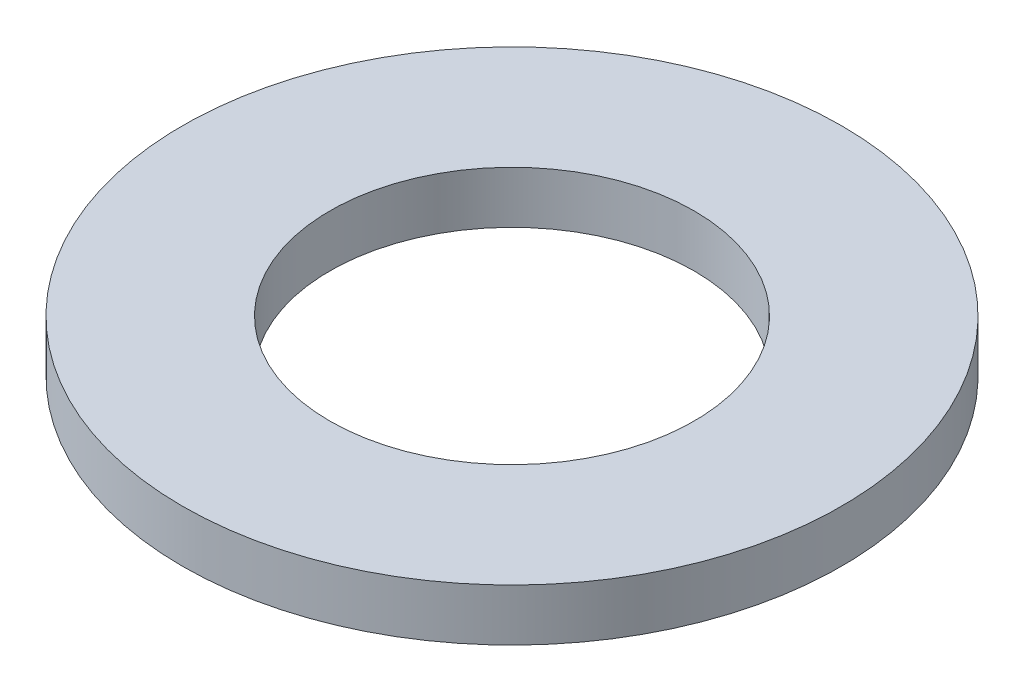
ISO-10303-21;
HEADER;
FILE_DESCRIPTION(('STEP AP214'),'2;1');
FILE_NAME('part.step','',(''),(''),'','','');
FILE_SCHEMA(('AUTOMOTIVE_DESIGN { 1 0 10303 214 1 1 1 1 }'));
ENDSEC;
DATA;
#1=APPLICATION_CONTEXT('core data for automotive mechanical design processes');
#2=APPLICATION_PROTOCOL_DEFINITION('international standard','automotive_design',2000,#1);
#3=PRODUCT_CONTEXT('',#1,'mechanical');
#4=PRODUCT('Part','Part','',(#3));
#5=PRODUCT_RELATED_PRODUCT_CATEGORY('part','',(#4));
#6=PRODUCT_DEFINITION_FORMATION('','',#4);
#7=PRODUCT_DEFINITION_CONTEXT('part definition',#1,'design');
#8=PRODUCT_DEFINITION('design','',#6,#7);
#9=PRODUCT_DEFINITION_SHAPE('','',#8);
#10=(LENGTH_UNIT() NAMED_UNIT(*) SI_UNIT(.MILLI.,.METRE.));
#11=(NAMED_UNIT(*) PLANE_ANGLE_UNIT() SI_UNIT($,.RADIAN.));
#12=(NAMED_UNIT(*) SI_UNIT($,.STERADIAN.) SOLID_ANGLE_UNIT());
#13=UNCERTAINTY_MEASURE_WITH_UNIT(LENGTH_MEASURE(1.E-05),#10,'distance_accuracy_value','');
#14=(GEOMETRIC_REPRESENTATION_CONTEXT(3) GLOBAL_UNCERTAINTY_ASSIGNED_CONTEXT((#13)) GLOBAL_UNIT_ASSIGNED_CONTEXT((#10,
#11,#12)) REPRESENTATION_CONTEXT('',''));
#15=CARTESIAN_POINT('',(0.,0.,0.));
#16=DIRECTION('',(0.,0.,1.));
#17=DIRECTION('',(1.,0.,0.));
#18=AXIS2_PLACEMENT_3D('',#15,#16,#17);
#19=CARTESIAN_POINT('',(0.,6.,0.));
#20=DIRECTION('',(0.,1.,0.));
#21=DIRECTION('',(0.,0.,1.));
#22=AXIS2_PLACEMENT_3D('',#19,#20,#21);
#23=PLANE('',#22);
#24=CARTESIAN_POINT('',(0.,6.,0.));
#25=DIRECTION('',(0.,1.,0.));
#26=DIRECTION('',(0.,0.,1.));
#27=AXIS2_PLACEMENT_3D('',#24,#25,#26);
#28=CIRCLE('',#27,38.);
#29=CARTESIAN_POINT('',(0.,6.,38.));
#30=VERTEX_POINT('',#29);
#31=EDGE_CURVE('E10',#30,#30,#28,.T.);
#32=ORIENTED_EDGE('',*,*,#31,.T.);
#33=EDGE_LOOP('',(#32));
#34=FACE_BOUND('',#33,.T.);
#35=CARTESIAN_POINT('',(0.,6.,0.));
#36=DIRECTION('',(0.,1.,0.));
#37=DIRECTION('',(0.,0.,1.));
#38=AXIS2_PLACEMENT_3D('',#35,#36,#37);
#39=CIRCLE('',#38,21.);
#40=CARTESIAN_POINT('',(0.,6.,21.));
#41=VERTEX_POINT('',#40);
#42=EDGE_CURVE('E48',#41,#41,#39,.T.);
#43=ORIENTED_EDGE('',*,*,#42,.F.);
#44=EDGE_LOOP('',(#43));
#45=FACE_BOUND('',#44,.T.);
#46=ADVANCED_FACE('F37',(#34,#45),#23,.T.);
#47=CARTESIAN_POINT('',(0.,0.,0.));
#48=DIRECTION('',(0.,1.,0.));
#49=DIRECTION('',(0.,0.,1.));
#50=AXIS2_PLACEMENT_3D('',#47,#48,#49);
#51=PLANE('',#50);
#52=CARTESIAN_POINT('',(0.,0.,0.));
#53=DIRECTION('',(0.,1.,0.));
#54=DIRECTION('',(0.,0.,1.));
#55=AXIS2_PLACEMENT_3D('',#52,#53,#54);
#56=CIRCLE('',#55,38.);
#57=CARTESIAN_POINT('',(0.,0.,38.));
#58=VERTEX_POINT('',#57);
#59=EDGE_CURVE('E41',#58,#58,#56,.T.);
#60=ORIENTED_EDGE('',*,*,#59,.F.);
#61=EDGE_LOOP('',(#60));
#62=FACE_BOUND('',#61,.T.);
#63=CARTESIAN_POINT('',(0.,0.,0.));
#64=DIRECTION('',(0.,1.,0.));
#65=DIRECTION('',(0.,0.,1.));
#66=AXIS2_PLACEMENT_3D('',#63,#64,#65);
#67=CIRCLE('',#66,21.);
#68=CARTESIAN_POINT('',(0.,0.,21.));
#69=VERTEX_POINT('',#68);
#70=EDGE_CURVE('E50',#69,#69,#67,.T.);
#71=ORIENTED_EDGE('',*,*,#70,.T.);
#72=EDGE_LOOP('',(#71));
#73=FACE_BOUND('',#72,.T.);
#74=ADVANCED_FACE('F60',(#62,#73),#51,.F.);
#75=CARTESIAN_POINT('',(0.,6.,0.));
#76=DIRECTION('',(0.,-1.,0.));
#77=DIRECTION('',(0.,0.,-1.));
#78=AXIS2_PLACEMENT_3D('',#75,#76,#77);
#79=CYLINDRICAL_SURFACE('',#78,38.);
#80=ORIENTED_EDGE('',*,*,#31,.F.);
#81=EDGE_LOOP('',(#80));
#82=FACE_BOUND('',#81,.T.);
#83=ORIENTED_EDGE('',*,*,#59,.T.);
#84=EDGE_LOOP('',(#83));
#85=FACE_BOUND('',#84,.T.);
#86=ADVANCED_FACE('F39',(#82,#85),#79,.T.);
#87=CARTESIAN_POINT('',(0.,6.,0.));
#88=DIRECTION('',(0.,-1.,0.));
#89=DIRECTION('',(0.,0.,-1.));
#90=AXIS2_PLACEMENT_3D('',#87,#88,#89);
#91=CYLINDRICAL_SURFACE('',#90,21.);
#92=ORIENTED_EDGE('',*,*,#42,.T.);
#93=EDGE_LOOP('',(#92));
#94=FACE_BOUND('',#93,.T.);
#95=ORIENTED_EDGE('',*,*,#70,.F.);
#96=EDGE_LOOP('',(#95));
#97=FACE_BOUND('',#96,.T.);
#98=ADVANCED_FACE('F56',(#94,#97),#91,.F.);
#99=CLOSED_SHELL('',(#46,#74,#86,#98));
#100=MANIFOLD_SOLID_BREP('B2',#99);
#101=ADVANCED_BREP_SHAPE_REPRESENTATION('',(#18,#100),#14);
#102=SHAPE_DEFINITION_REPRESENTATION(#9,#101);
ENDSEC;
END-ISO-10303-21;
